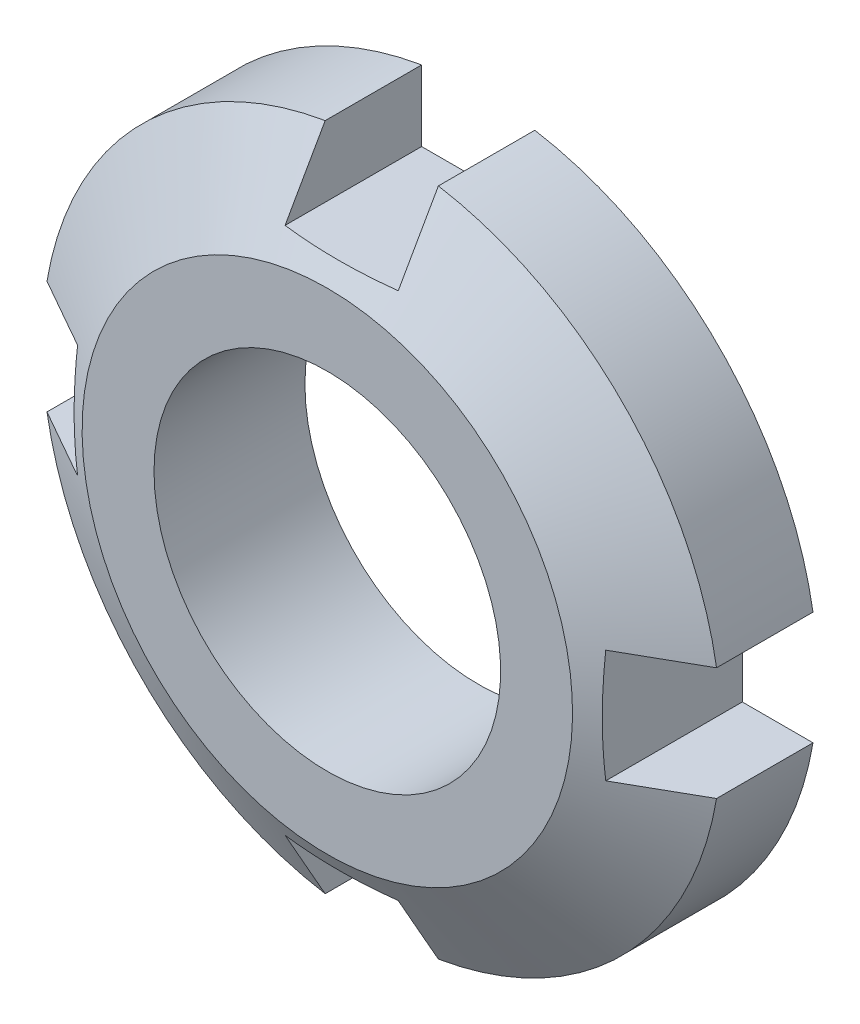
ISO-10303-21;
HEADER;
FILE_DESCRIPTION(('STEP AP214'),'2;1');
FILE_NAME('part.step','',(''),(''),'','','');
FILE_SCHEMA(('AUTOMOTIVE_DESIGN { 1 0 10303 214 1 1 1 1 }'));
ENDSEC;
DATA;
#1=APPLICATION_CONTEXT('core data for automotive mechanical design processes');
#2=APPLICATION_PROTOCOL_DEFINITION('international standard','automotive_design',2000,#1);
#3=PRODUCT_CONTEXT('',#1,'mechanical');
#4=PRODUCT('Part','Part','',(#3));
#5=PRODUCT_RELATED_PRODUCT_CATEGORY('part','',(#4));
#6=PRODUCT_DEFINITION_FORMATION('','',#4);
#7=PRODUCT_DEFINITION_CONTEXT('part definition',#1,'design');
#8=PRODUCT_DEFINITION('design','',#6,#7);
#9=PRODUCT_DEFINITION_SHAPE('','',#8);
#10=(LENGTH_UNIT() NAMED_UNIT(*) SI_UNIT(.MILLI.,.METRE.));
#11=(NAMED_UNIT(*) PLANE_ANGLE_UNIT() SI_UNIT($,.RADIAN.));
#12=(NAMED_UNIT(*) SI_UNIT($,.STERADIAN.) SOLID_ANGLE_UNIT());
#13=UNCERTAINTY_MEASURE_WITH_UNIT(LENGTH_MEASURE(1.E-05),#10,'distance_accuracy_value','');
#14=(GEOMETRIC_REPRESENTATION_CONTEXT(3) GLOBAL_UNCERTAINTY_ASSIGNED_CONTEXT((#13)) GLOBAL_UNIT_ASSIGNED_CONTEXT((#10,
#11,#12)) REPRESENTATION_CONTEXT('',''));
#15=CARTESIAN_POINT('',(0.,0.,0.));
#16=DIRECTION('',(0.,0.,1.));
#17=DIRECTION('',(1.,0.,0.));
#18=AXIS2_PLACEMENT_3D('',#15,#16,#17);
#19=CARTESIAN_POINT('',(0.,0.,0.));
#20=DIRECTION('',(0.,0.,-1.));
#21=DIRECTION('',(0.,1.,0.));
#22=AXIS2_PLACEMENT_3D('',#19,#20,#21);
#23=PLANE('',#22);
#24=CARTESIAN_POINT('',(0.,0.,0.));
#25=DIRECTION('',(0.,0.,-1.));
#26=DIRECTION('',(-1.,0.,0.));
#27=AXIS2_PLACEMENT_3D('',#24,#25,#26);
#28=CIRCLE('',#27,4.59399999999999);
#29=CARTESIAN_POINT('',(-4.59399999999999,0.,0.));
#30=VERTEX_POINT('',#29);
#31=EDGE_CURVE('E238',#30,#30,#28,.T.);
#32=ORIENTED_EDGE('',*,*,#31,.F.);
#33=EDGE_LOOP('',(#32));
#34=FACE_BOUND('',#33,.T.);
#35=CARTESIAN_POINT('',(0.,0.,0.));
#36=DIRECTION('',(0.,0.,-1.));
#37=DIRECTION('',(0.,1.,0.));
#38=AXIS2_PLACEMENT_3D('',#35,#36,#37);
#39=CIRCLE('',#38,9.);
#40=CARTESIAN_POINT('',(8.87411967464942,-1.5,0.));
#41=VERTEX_POINT('',#40);
#42=CARTESIAN_POINT('',(1.5,-8.87411967464942,0.));
#43=VERTEX_POINT('',#42);
#44=EDGE_CURVE('E174',#41,#43,#39,.T.);
#45=ORIENTED_EDGE('',*,*,#44,.T.);
#46=DIRECTION('',(0.,1.,0.));
#47=VECTOR('',#46,1.);
#48=CARTESIAN_POINT('',(1.5,-9.,0.));
#49=LINE('',#48,#47);
#50=CARTESIAN_POINT('',(1.5,-7.,0.));
#51=VERTEX_POINT('',#50);
#52=EDGE_CURVE('E158',#43,#51,#49,.T.);
#53=ORIENTED_EDGE('',*,*,#52,.T.);
#54=DIRECTION('',(-1.,0.,0.));
#55=VECTOR('',#54,1.);
#56=CARTESIAN_POINT('',(1.5,-7.,0.));
#57=LINE('',#56,#55);
#58=CARTESIAN_POINT('',(-1.5,-7.,0.));
#59=VERTEX_POINT('',#58);
#60=EDGE_CURVE('E165',#51,#59,#57,.T.);
#61=ORIENTED_EDGE('',*,*,#60,.T.);
#62=DIRECTION('',(0.,-1.,0.));
#63=VECTOR('',#62,1.);
#64=CARTESIAN_POINT('',(-1.5,-9.,0.));
#65=LINE('',#64,#63);
#66=CARTESIAN_POINT('',(-1.5,-8.87411967464942,0.));
#67=VERTEX_POINT('',#66);
#68=EDGE_CURVE('E169',#59,#67,#65,.T.);
#69=ORIENTED_EDGE('',*,*,#68,.T.);
#70=CARTESIAN_POINT('',(-8.87411967464942,-1.5,0.));
#71=VERTEX_POINT('',#70);
#72=EDGE_CURVE('E258',#67,#71,#39,.T.);
#73=ORIENTED_EDGE('',*,*,#72,.T.);
#74=DIRECTION('',(1.,0.,0.));
#75=VECTOR('',#74,1.);
#76=CARTESIAN_POINT('',(-9.,-1.5,0.));
#77=LINE('',#76,#75);
#78=CARTESIAN_POINT('',(-7.,-1.5,0.));
#79=VERTEX_POINT('',#78);
#80=EDGE_CURVE('E200',#71,#79,#77,.T.);
#81=ORIENTED_EDGE('',*,*,#80,.T.);
#82=DIRECTION('',(0.,1.,0.));
#83=VECTOR('',#82,1.);
#84=CARTESIAN_POINT('',(-7.,1.5,0.));
#85=LINE('',#84,#83);
#86=CARTESIAN_POINT('',(-7.,1.5,0.));
#87=VERTEX_POINT('',#86);
#88=EDGE_CURVE('E203',#79,#87,#85,.T.);
#89=ORIENTED_EDGE('',*,*,#88,.T.);
#90=DIRECTION('',(-1.,0.,0.));
#91=VECTOR('',#90,1.);
#92=CARTESIAN_POINT('',(-9.,1.5,0.));
#93=LINE('',#92,#91);
#94=CARTESIAN_POINT('',(-8.87411967464942,1.5,0.));
#95=VERTEX_POINT('',#94);
#96=EDGE_CURVE('E206',#87,#95,#93,.T.);
#97=ORIENTED_EDGE('',*,*,#96,.T.);
#98=CARTESIAN_POINT('',(-1.5,8.87411967464942,0.));
#99=VERTEX_POINT('',#98);
#100=EDGE_CURVE('E251',#95,#99,#39,.T.);
#101=ORIENTED_EDGE('',*,*,#100,.T.);
#102=DIRECTION('',(0.,-1.,0.));
#103=VECTOR('',#102,1.);
#104=CARTESIAN_POINT('',(-1.5,9.,0.));
#105=LINE('',#104,#103);
#106=CARTESIAN_POINT('',(-1.5,7.,0.));
#107=VERTEX_POINT('',#106);
#108=EDGE_CURVE('E219',#99,#107,#105,.T.);
#109=ORIENTED_EDGE('',*,*,#108,.T.);
#110=DIRECTION('',(1.,0.,0.));
#111=VECTOR('',#110,1.);
#112=CARTESIAN_POINT('',(-1.5,7.,0.));
#113=LINE('',#112,#111);
#114=CARTESIAN_POINT('',(1.5,7.,0.));
#115=VERTEX_POINT('',#114);
#116=EDGE_CURVE('E222',#107,#115,#113,.T.);
#117=ORIENTED_EDGE('',*,*,#116,.T.);
#118=DIRECTION('',(0.,1.,0.));
#119=VECTOR('',#118,1.);
#120=CARTESIAN_POINT('',(1.5,9.,0.));
#121=LINE('',#120,#119);
#122=CARTESIAN_POINT('',(1.5,8.87411967464942,0.));
#123=VERTEX_POINT('',#122);
#124=EDGE_CURVE('E225',#115,#123,#121,.T.);
#125=ORIENTED_EDGE('',*,*,#124,.T.);
#126=CARTESIAN_POINT('',(8.87411967464942,1.5,0.));
#127=VERTEX_POINT('',#126);
#128=EDGE_CURVE('E254',#123,#127,#39,.T.);
#129=ORIENTED_EDGE('',*,*,#128,.T.);
#130=DIRECTION('',(-1.,0.,0.));
#131=VECTOR('',#130,1.);
#132=CARTESIAN_POINT('',(9.,1.5,0.));
#133=LINE('',#132,#131);
#134=CARTESIAN_POINT('',(7.,1.5,0.));
#135=VERTEX_POINT('',#134);
#136=EDGE_CURVE('E183',#127,#135,#133,.T.);
#137=ORIENTED_EDGE('',*,*,#136,.T.);
#138=DIRECTION('',(0.,-1.,0.));
#139=VECTOR('',#138,1.);
#140=CARTESIAN_POINT('',(7.,1.5,0.));
#141=LINE('',#140,#139);
#142=CARTESIAN_POINT('',(7.,-1.5,0.));
#143=VERTEX_POINT('',#142);
#144=EDGE_CURVE('E186',#135,#143,#141,.T.);
#145=ORIENTED_EDGE('',*,*,#144,.T.);
#146=DIRECTION('',(1.,0.,0.));
#147=VECTOR('',#146,1.);
#148=CARTESIAN_POINT('',(9.,-1.5,0.));
#149=LINE('',#148,#147);
#150=EDGE_CURVE('E189',#143,#41,#149,.T.);
#151=ORIENTED_EDGE('',*,*,#150,.T.);
#152=EDGE_LOOP('',(#45,#53,#61,#69,#73,#81,#89,#97,#101,#109,#117,#125,#129,#137,#145,#151));
#153=FACE_BOUND('',#152,.T.);
#154=ADVANCED_FACE('F38',(#34,#153),#23,.T.);
#155=CARTESIAN_POINT('',(0.,0.,0.));
#156=DIRECTION('',(0.,0.,-1.));
#157=DIRECTION('',(0.,1.,0.));
#158=AXIS2_PLACEMENT_3D('',#155,#156,#157);
#159=CYLINDRICAL_SURFACE('',#158,9.);
#160=CARTESIAN_POINT('',(0.,0.,2.55662432702593));
#161=DIRECTION('',(0.,0.,-1.));
#162=DIRECTION('',(0.,1.,0.));
#163=AXIS2_PLACEMENT_3D('',#160,#161,#162);
#164=CIRCLE('',#163,9.);
#165=CARTESIAN_POINT('',(8.87411967464942,-1.5,2.55662432702593));
#166=VERTEX_POINT('',#165);
#167=CARTESIAN_POINT('',(1.5,-8.87411967464942,2.55662432702593));
#168=VERTEX_POINT('',#167);
#169=EDGE_CURVE('E252',#166,#168,#164,.T.);
#170=ORIENTED_EDGE('',*,*,#169,.T.);
#171=DIRECTION('',(0.,0.,-1.));
#172=VECTOR('',#171,1.);
#173=CARTESIAN_POINT('',(1.5,-8.87411967464942,0.));
#174=LINE('',#173,#172);
#175=EDGE_CURVE('E181',#168,#43,#174,.T.);
#176=ORIENTED_EDGE('',*,*,#175,.T.);
#177=ORIENTED_EDGE('',*,*,#44,.F.);
#178=DIRECTION('',(0.,0.,-1.));
#179=VECTOR('',#178,1.);
#180=CARTESIAN_POINT('',(8.87411967464942,-1.5,0.));
#181=LINE('',#180,#179);
#182=EDGE_CURVE('E194',#41,#166,#181,.F.);
#183=ORIENTED_EDGE('',*,*,#182,.T.);
#184=EDGE_LOOP('',(#170,#176,#177,#183));
#185=FACE_BOUND('',#184,.T.);
#186=ADVANCED_FACE('F328',(#185),#159,.T.);
#187=ORIENTED_EDGE('',*,*,#72,.F.);
#188=DIRECTION('',(0.,0.,-1.));
#189=VECTOR('',#188,1.);
#190=CARTESIAN_POINT('',(-1.5,-8.87411967464942,0.));
#191=LINE('',#190,#189);
#192=CARTESIAN_POINT('',(-1.5,-8.87411967464942,2.55662432702593));
#193=VERTEX_POINT('',#192);
#194=EDGE_CURVE('E162',#67,#193,#191,.F.);
#195=ORIENTED_EDGE('',*,*,#194,.T.);
#196=CARTESIAN_POINT('',(-8.87411967464942,-1.5,2.55662432702593));
#197=VERTEX_POINT('',#196);
#198=EDGE_CURVE('E253',#193,#197,#164,.T.);
#199=ORIENTED_EDGE('',*,*,#198,.T.);
#200=DIRECTION('',(0.,0.,-1.));
#201=VECTOR('',#200,1.);
#202=CARTESIAN_POINT('',(-8.87411967464942,-1.5,0.));
#203=LINE('',#202,#201);
#204=EDGE_CURVE('E216',#197,#71,#203,.T.);
#205=ORIENTED_EDGE('',*,*,#204,.T.);
#206=EDGE_LOOP('',(#187,#195,#199,#205));
#207=FACE_BOUND('',#206,.T.);
#208=ADVANCED_FACE('F333',(#207),#159,.T.);
#209=CARTESIAN_POINT('',(0.,0.,2.55662432702593));
#210=DIRECTION('',(0.,0.,-1.));
#211=DIRECTION('',(0.,1.,0.));
#212=AXIS2_PLACEMENT_3D('',#209,#210,#211);
#213=CONICAL_SURFACE('',#212,9.,1.0471975511966);
#214=CARTESIAN_POINT('',(0.,0.,4.));
#215=DIRECTION('',(0.,0.,-1.));
#216=DIRECTION('',(0.,1.,0.));
#217=AXIS2_PLACEMENT_3D('',#214,#215,#216);
#218=CIRCLE('',#217,6.5);
#219=CARTESIAN_POINT('',(0.,6.5,4.));
#220=VERTEX_POINT('',#219);
#221=EDGE_CURVE('E244',#220,#220,#218,.T.);
#222=ORIENTED_EDGE('',*,*,#221,.T.);
#223=EDGE_LOOP('',(#222));
#224=FACE_BOUND('',#223,.T.);
#225=CARTESIAN_POINT('',(-6.60803773799291,-7.,2.19501452779652));
#226=CARTESIAN_POINT('',(-6.38482094485606,-7.,2.28345242499498));
#227=CARTESIAN_POINT('',(-6.1607954440703,-7.,2.3698958757828));
#228=CARTESIAN_POINT('',(-5.71084766121369,-7.,2.5379234343994));
#229=CARTESIAN_POINT('',(-5.48492477034531,-7.,2.61950590882143));
#230=CARTESIAN_POINT('',(-5.02982445330478,-7.,2.77730630750442));
#231=CARTESIAN_POINT('',(-4.80063603398555,-7.,2.85349283377197));
#232=CARTESIAN_POINT('',(-4.34008923571827,-7.,2.99885984146847));
#233=CARTESIAN_POINT('',(-4.10873105569413,-7.,3.06804095842452));
#234=CARTESIAN_POINT('',(-3.425776991095,-7.,3.25904950570636));
#235=CARTESIAN_POINT('',(-2.97082288619208,-7.,3.36951126251846));
#236=CARTESIAN_POINT('',(-2.28278535795962,-7.,3.50367178193693));
#237=CARTESIAN_POINT('',(-2.05273634867589,-7.,3.54311302932607));
#238=CARTESIAN_POINT('',(-1.59094384724694,-7.,3.6102669930596));
#239=CARTESIAN_POINT('',(-1.35920059356612,-7.,3.63798132882123));
#240=CARTESIAN_POINT('',(-0.809979974229756,-7.,3.68836049911879));
#241=CARTESIAN_POINT('',(-0.49197616406506,-7.,3.70552266227315));
#242=CARTESIAN_POINT('',(0.144641941210663,-7.,3.71463987385341));
#243=CARTESIAN_POINT('',(0.46325650751978,-7.,3.70657731748422));
#244=CARTESIAN_POINT('',(0.943233982618241,-7.,3.67586867068627));
#245=CARTESIAN_POINT('',(1.10523383170887,-7.,3.66229228187502));
#246=CARTESIAN_POINT('',(1.42862375519057,-7.,3.62903708551741));
#247=CARTESIAN_POINT('',(1.5900137867909,-7.,3.60935785749967));
#248=CARTESIAN_POINT('',(1.91186468051426,-7.,3.56426603760904));
#249=CARTESIAN_POINT('',(2.07232612348097,-7.,3.53885754685647));
#250=CARTESIAN_POINT('',(2.39228625310242,-7.,3.48273532700505));
#251=CARTESIAN_POINT('',(2.55178513392221,-7.,3.45202270756223));
#252=CARTESIAN_POINT('',(2.71076148925265,-7.,3.41887058817287));
#253=B_SPLINE_CURVE_WITH_KNOTS('',3,(#225,#226,#227,#228,#229,#230,#231,#232,#233,#234,#235,
#236,#237,#238,#239,#240,#241,#242,#243,#244,#245,#246,#247,#248,#249,#250,#251,#252),
.UNSPECIFIED.,.F.,.F.,(4,2,2,2,2,2,2,2,2,2,2,2,2,4),(0.,0.720307917474698,1.44085652662286,
2.16530192115533,2.88968153538715,4.29239440099747,4.99236196751632,5.69223284107739,
6.64665173394746,7.6017368818483,8.08934224559687,8.57698121168375,9.06427221800965,
9.55146140330965),.UNSPECIFIED.);
#254=CARTESIAN_POINT('',(-1.5,-7.,3.61957782718682));
#255=VERTEX_POINT('',#254);
#256=CARTESIAN_POINT('',(1.5,-7.,3.61957782718682));
#257=VERTEX_POINT('',#256);
#258=EDGE_CURVE('E50',#255,#257,#253,.T.);
#259=ORIENTED_EDGE('',*,*,#258,.T.);
#260=CARTESIAN_POINT('',(1.5,-4.51467978783632,5.00612220364092));
#261=CARTESIAN_POINT('',(1.5,-4.68693959407264,4.9117250538693));
#262=CARTESIAN_POINT('',(1.5,-4.85898620881287,4.81694043778456));
#263=CARTESIAN_POINT('',(1.5,-5.20273855542667,4.62675676645979));
#264=CARTESIAN_POINT('',(1.5,-5.37444428891128,4.53135771413276));
#265=CARTESIAN_POINT('',(1.5,-5.71759997995971,4.34010589422538));
#266=CARTESIAN_POINT('',(1.5,-5.88904994051637,4.24425313200963));
#267=CARTESIAN_POINT('',(1.5,-6.23175002566476,4.05219057913551));
#268=CARTESIAN_POINT('',(1.5,-6.40300014998253,3.95598078798846));
#269=CARTESIAN_POINT('',(1.5,-6.91650897072724,3.66693700990015));
#270=CARTESIAN_POINT('',(1.5,-7.25853238799103,3.47368511418433));
#271=CARTESIAN_POINT('',(1.5,-7.94216849744405,3.08645415212913));
#272=CARTESIAN_POINT('',(1.5,-8.28378118818812,2.892475083241));
#273=CARTESIAN_POINT('',(1.5,-8.96671195027129,2.50401460332847));
#274=CARTESIAN_POINT('',(1.5,-9.30803002722762,2.30953320217727));
#275=CARTESIAN_POINT('',(1.5,-9.99045971886807,1.92020980934183));
#276=CARTESIAN_POINT('',(1.5,-10.3315713338536,1.72536781818574));
#277=CARTESIAN_POINT('',(1.5,-11.3546764457974,1.14041538901457));
#278=CARTESIAN_POINT('',(1.5,-12.0364296537756,0.74988450758946));
#279=CARTESIAN_POINT('',(1.5,-12.7180455932196,0.359115416959897));
#280=B_SPLINE_CURVE_WITH_KNOTS('',3,(#260,#261,#262,#263,#264,#265,#266,#267,#268,#269,#270,
#271,#272,#273,#274,#275,#276,#277,#278,#279),.UNSPECIFIED.,.F.,.F.,(4,2,2,2,2,2,2,2,2,4),(0.,
0.589284735529803,1.17856667936321,1.76784167292643,2.35711747335124,3.53564751811737,
4.71418169752645,5.89269288684273,7.07120235137822,9.42825772467926),.UNSPECIFIED.);
#281=EDGE_CURVE('E11',#257,#168,#280,.T.);
#282=ORIENTED_EDGE('',*,*,#281,.T.);
#283=ORIENTED_EDGE('',*,*,#169,.F.);
#284=CARTESIAN_POINT('',(11.9636345363038,-1.5,0.791489720304736));
#285=CARTESIAN_POINT('',(11.622757423634,-1.5,0.986760179869544));
#286=CARTESIAN_POINT('',(11.2818295472936,-1.5,1.1819421654886));
#287=CARTESIAN_POINT('',(10.5998274317525,-1.5,1.57205048639679));
#288=CARTESIAN_POINT('',(10.2587531925056,-1.5,1.76697682160527));
#289=CARTESIAN_POINT('',(9.57642396809998,-1.5,2.15648917183095));
#290=CARTESIAN_POINT('',(9.235168988672,-1.5,2.35107519688464));
#291=CARTESIAN_POINT('',(8.55239494097444,-1.5,2.73978626759009));
#292=CARTESIAN_POINT('',(8.21087587181288,-1.5,2.93391131167576));
#293=CARTESIAN_POINT('',(7.52744950400627,-1.5,3.32150911424444));
#294=CARTESIAN_POINT('',(7.18554219028835,-1.5,3.51498184615861));
#295=CARTESIAN_POINT('',(6.50117556688201,-1.5,3.9009436650992));
#296=CARTESIAN_POINT('',(6.15871626162175,-1.5,4.09343275996534));
#297=CARTESIAN_POINT('',(5.64435744918873,-1.5,4.38098377398079));
#298=CARTESIAN_POINT('',(5.47278964539379,-1.5,4.47663879011197));
#299=CARTESIAN_POINT('',(5.12936370669175,-1.5,4.66742495456));
#300=CARTESIAN_POINT('',(4.95750557282013,-1.5,4.76255610474013));
#301=CARTESIAN_POINT('',(4.61340494716609,-1.5,4.95213309171488));
#302=CARTESIAN_POINT('',(4.44116244505361,-1.5,5.04657890979368));
#303=CARTESIAN_POINT('',(4.09614322334866,-1.5,5.23449413455944));
#304=CARTESIAN_POINT('',(3.92336649717775,-1.5,5.32796352916015));
#305=CARTESIAN_POINT('',(3.75024752574206,-1.5,5.42079929813102));
#306=B_SPLINE_CURVE_WITH_KNOTS('',3,(#284,#285,#286,#287,#288,#289,#290,#291,#292,#293,#294,
#295,#296,#297,#298,#299,#300,#301,#302,#303,#304,#305),.UNSPECIFIED.,.F.,.F.,(4,2,2,2,2,2,2,2,
2,2,4),(0.,1.17853724953704,2.35707487079881,3.53557712764535,4.71408338253777,5.89263707205156,
7.07118135362958,7.6604755982819,8.24976774560238,8.83907592587174,9.4283913920213),.UNSPECIFIED.);
#307=CARTESIAN_POINT('',(7.,-1.5,3.61957782718682));
#308=VERTEX_POINT('',#307);
#309=EDGE_CURVE('E381',#166,#308,#306,.T.);
#310=ORIENTED_EDGE('',*,*,#309,.T.);
#311=CARTESIAN_POINT('',(7.,-6.60803773799292,2.19501452779652));
#312=CARTESIAN_POINT('',(7.,-6.38482094485606,2.28345242499498));
#313=CARTESIAN_POINT('',(7.,-6.1607954440703,2.3698958757828));
#314=CARTESIAN_POINT('',(7.,-5.71084766121369,2.5379234343994));
#315=CARTESIAN_POINT('',(7.,-5.48492477034531,2.61950590882143));
#316=CARTESIAN_POINT('',(7.,-5.02982445330478,2.77730630750442));
#317=CARTESIAN_POINT('',(7.,-4.80063603398555,2.85349283377197));
#318=CARTESIAN_POINT('',(7.,-4.34008923571827,2.99885984146847));
#319=CARTESIAN_POINT('',(7.,-4.10873105569413,3.06804095842452));
#320=CARTESIAN_POINT('',(7.,-3.425776991095,3.25904950570636));
#321=CARTESIAN_POINT('',(7.,-2.97082288619208,3.36951126251846));
#322=CARTESIAN_POINT('',(7.,-2.28278535795962,3.50367178193693));
#323=CARTESIAN_POINT('',(7.,-2.05273634867589,3.54311302932607));
#324=CARTESIAN_POINT('',(7.,-1.59094384724694,3.61026699305961));
#325=CARTESIAN_POINT('',(7.,-1.35920059356612,3.63798132882124));
#326=CARTESIAN_POINT('',(7.,-0.80997997422976,3.68836049911879));
#327=CARTESIAN_POINT('',(7.,-0.491976164065064,3.70552266227315));
#328=CARTESIAN_POINT('',(7.,0.144641941210659,3.71463987385341));
#329=CARTESIAN_POINT('',(7.,0.463256507519776,3.70657731748422));
#330=CARTESIAN_POINT('',(7.,0.943233982618237,3.67586867068627));
#331=CARTESIAN_POINT('',(7.,1.10523383170887,3.66229228187502));
#332=CARTESIAN_POINT('',(7.,1.42862375519056,3.62903708551742));
#333=CARTESIAN_POINT('',(7.,1.5900137867909,3.60935785749968));
#334=CARTESIAN_POINT('',(7.,1.91186468051426,3.56426603760904));
#335=CARTESIAN_POINT('',(7.,2.07232612348097,3.53885754685647));
#336=CARTESIAN_POINT('',(7.,2.39228625310242,3.48273532700506));
#337=CARTESIAN_POINT('',(7.,2.55178513392221,3.45202270756223));
#338=CARTESIAN_POINT('',(7.,2.71076148925265,3.41887058817287));
#339=B_SPLINE_CURVE_WITH_KNOTS('',3,(#311,#312,#313,#314,#315,#316,#317,#318,#319,#320,#321,
#322,#323,#324,#325,#326,#327,#328,#329,#330,#331,#332,#333,#334,#335,#336,#337,#338),
.UNSPECIFIED.,.F.,.F.,(4,2,2,2,2,2,2,2,2,2,2,2,2,4),(0.,0.720307917474699,1.44085652662286,
2.16530192115533,2.88968153538715,4.29239440099747,4.99236196751632,5.69223284107739,
6.64665173394746,7.60173688184829,8.08934224559686,8.57698121168375,9.06427221800965,
9.55146140330965),.UNSPECIFIED.);
#340=CARTESIAN_POINT('',(7.,1.5,3.61957782718682));
#341=VERTEX_POINT('',#340);
#342=EDGE_CURVE('E387',#308,#341,#339,.T.);
#343=ORIENTED_EDGE('',*,*,#342,.T.);
#344=CARTESIAN_POINT('',(3.75024752574206,1.5,5.42079929813102));
#345=CARTESIAN_POINT('',(3.92336649717775,1.5,5.32796352916015));
#346=CARTESIAN_POINT('',(4.09614322334866,1.5,5.23449413455944));
#347=CARTESIAN_POINT('',(4.44116244505361,1.5,5.04657890979368));
#348=CARTESIAN_POINT('',(4.61340494716609,1.5,4.95213309171488));
#349=CARTESIAN_POINT('',(4.95750557282013,1.5,4.76255610474013));
#350=CARTESIAN_POINT('',(5.12936370669175,1.5,4.66742495456));
#351=CARTESIAN_POINT('',(5.47278964539379,1.5,4.47663879011197));
#352=CARTESIAN_POINT('',(5.64435744918872,1.5,4.38098377398079));
#353=CARTESIAN_POINT('',(6.15871626162174,1.5,4.09343275996534));
#354=CARTESIAN_POINT('',(6.50117556688201,1.5,3.9009436650992));
#355=CARTESIAN_POINT('',(7.18554219028835,1.5,3.51498184615861));
#356=CARTESIAN_POINT('',(7.52744950400627,1.5,3.32150911424444));
#357=CARTESIAN_POINT('',(8.21087587181288,1.5,2.93391131167576));
#358=CARTESIAN_POINT('',(8.55239494097444,1.5,2.73978626759009));
#359=CARTESIAN_POINT('',(9.23516898867199,1.5,2.35107519688464));
#360=CARTESIAN_POINT('',(9.57642396809998,1.5,2.15648917183096));
#361=CARTESIAN_POINT('',(10.2587531925056,1.5,1.76697682160527));
#362=CARTESIAN_POINT('',(10.5998274317525,1.5,1.57205048639679));
#363=CARTESIAN_POINT('',(11.2818295472936,1.5,1.1819421654886));
#364=CARTESIAN_POINT('',(11.622757423634,1.5,0.986760179869544));
#365=CARTESIAN_POINT('',(11.9636345363038,1.5,0.791489720304737));
#366=B_SPLINE_CURVE_WITH_KNOTS('',3,(#344,#345,#346,#347,#348,#349,#350,#351,#352,#353,#354,
#355,#356,#357,#358,#359,#360,#361,#362,#363,#364,#365),.UNSPECIFIED.,.F.,.F.,(4,2,2,2,2,2,2,2,
2,2,4),(0.,0.589315466149557,1.17862364641892,1.7679157937394,2.35721003839172,3.53575431996974,
4.71430800948353,5.89281426437595,7.07131652122248,8.24985414248425,9.4283913920213),.UNSPECIFIED.);
#367=CARTESIAN_POINT('',(8.87411967464942,1.5,2.55662432702593));
#368=VERTEX_POINT('',#367);
#369=EDGE_CURVE('E357',#341,#368,#366,.T.);
#370=ORIENTED_EDGE('',*,*,#369,.T.);
#371=CARTESIAN_POINT('',(1.5,8.87411967464942,2.55662432702593));
#372=VERTEX_POINT('',#371);
#373=EDGE_CURVE('E248',#372,#368,#164,.T.);
#374=ORIENTED_EDGE('',*,*,#373,.F.);
#375=CARTESIAN_POINT('',(1.5,11.9636345363038,0.791489720304739));
#376=CARTESIAN_POINT('',(1.5,11.622757423634,0.986760179869546));
#377=CARTESIAN_POINT('',(1.5,11.2818295472936,1.1819421654886));
#378=CARTESIAN_POINT('',(1.5,10.5998274317525,1.57205048639679));
#379=CARTESIAN_POINT('',(1.5,10.2587531925056,1.76697682160527));
#380=CARTESIAN_POINT('',(1.5,9.57642396809998,2.15648917183096));
#381=CARTESIAN_POINT('',(1.5,9.23516898867199,2.35107519688464));
#382=CARTESIAN_POINT('',(1.5,8.55239494097444,2.73978626759009));
#383=CARTESIAN_POINT('',(1.5,8.21087587181288,2.93391131167576));
#384=CARTESIAN_POINT('',(1.5,7.52744950400628,3.32150911424444));
#385=CARTESIAN_POINT('',(1.5,7.18554219028835,3.51498184615861));
#386=CARTESIAN_POINT('',(1.5,6.50117556688201,3.9009436650992));
#387=CARTESIAN_POINT('',(1.5,6.15871626162175,4.09343275996534));
#388=CARTESIAN_POINT('',(1.5,5.64435744918873,4.38098377398079));
#389=CARTESIAN_POINT('',(1.5,5.47278964539379,4.47663879011197));
#390=CARTESIAN_POINT('',(1.5,5.12936370669176,4.66742495456));
#391=CARTESIAN_POINT('',(1.5,4.95750557282013,4.76255610474013));
#392=CARTESIAN_POINT('',(1.5,4.6134049471661,4.95213309171488));
#393=CARTESIAN_POINT('',(1.5,4.44116244505362,5.04657890979368));
#394=CARTESIAN_POINT('',(1.5,4.09614322334867,5.23449413455944));
#395=CARTESIAN_POINT('',(1.5,3.92336649717775,5.32796352916015));
#396=CARTESIAN_POINT('',(1.5,3.75024752574207,5.42079929813101));
#397=B_SPLINE_CURVE_WITH_KNOTS('',3,(#375,#376,#377,#378,#379,#380,#381,#382,#383,#384,#385,
#386,#387,#388,#389,#390,#391,#392,#393,#394,#395,#396),.UNSPECIFIED.,.F.,.F.,(4,2,2,2,2,2,2,2,
2,2,4),(0.,1.17853724953704,2.35707487079881,3.53557712764535,4.71408338253777,5.89263707205155,
7.07118135362957,7.6604755982819,8.24976774560237,8.83907592587173,9.42839139202129),.UNSPECIFIED.);
#398=CARTESIAN_POINT('',(1.5,7.,3.61957782718682));
#399=VERTEX_POINT('',#398);
#400=EDGE_CURVE('E257',#372,#399,#397,.T.);
#401=ORIENTED_EDGE('',*,*,#400,.T.);
#402=CARTESIAN_POINT('',(2.71076148925265,7.,3.41887058817287));
#403=CARTESIAN_POINT('',(2.55178513392221,7.,3.45202270756223));
#404=CARTESIAN_POINT('',(2.39228625310242,7.,3.48273532700506));
#405=CARTESIAN_POINT('',(2.07232612348097,7.,3.53885754685647));
#406=CARTESIAN_POINT('',(1.91186468051426,7.,3.56426603760904));
#407=CARTESIAN_POINT('',(1.5900137867909,7.,3.60935785749968));
#408=CARTESIAN_POINT('',(1.42862375519056,7.,3.62903708551741));
#409=CARTESIAN_POINT('',(1.10523383170887,7.,3.66229228187502));
#410=CARTESIAN_POINT('',(0.943233982618238,7.,3.67586867068627));
#411=CARTESIAN_POINT('',(0.463256507519777,7.,3.70657731748422));
#412=CARTESIAN_POINT('',(0.14464194121066,7.,3.71463987385341));
#413=CARTESIAN_POINT('',(-0.491976164065064,7.,3.70552266227315));
#414=CARTESIAN_POINT('',(-0.80997997422976,7.,3.68836049911879));
#415=CARTESIAN_POINT('',(-1.35920059356612,7.,3.63798132882124));
#416=CARTESIAN_POINT('',(-1.59094384724694,7.,3.61026699305961));
#417=CARTESIAN_POINT('',(-2.05273634867589,7.,3.54311302932607));
#418=CARTESIAN_POINT('',(-2.28278535795962,7.,3.50367178193693));
#419=CARTESIAN_POINT('',(-2.97082288619208,7.,3.36951126251846));
#420=CARTESIAN_POINT('',(-3.425776991095,7.,3.25904950570636));
#421=CARTESIAN_POINT('',(-4.10873105569413,7.,3.06804095842452));
#422=CARTESIAN_POINT('',(-4.34008923571827,7.,2.99885984146847));
#423=CARTESIAN_POINT('',(-4.80063603398555,7.,2.85349283377197));
#424=CARTESIAN_POINT('',(-5.02982445330478,7.,2.77730630750442));
#425=CARTESIAN_POINT('',(-5.48492477034531,7.,2.61950590882143));
#426=CARTESIAN_POINT('',(-5.71084766121369,7.,2.5379234343994));
#427=CARTESIAN_POINT('',(-6.1607954440703,7.,2.3698958757828));
#428=CARTESIAN_POINT('',(-6.38482094485606,7.,2.28345242499498));
#429=CARTESIAN_POINT('',(-6.60803773799292,7.,2.19501452779652));
#430=B_SPLINE_CURVE_WITH_KNOTS('',3,(#402,#403,#404,#405,#406,#407,#408,#409,#410,#411,#412,
#413,#414,#415,#416,#417,#418,#419,#420,#421,#422,#423,#424,#425,#426,#427,#428,#429),
.UNSPECIFIED.,.F.,.F.,(4,2,2,2,2,2,2,2,2,2,2,2,2,4),(0.,0.487189185299999,0.974480191625907,
1.46211915771279,1.94972452146136,2.90480966936219,3.85922856223227,4.55909943579334,
5.25906700231219,6.6617798679225,7.38615948215432,8.1106048766868,8.83115348583495,
9.55146140330965),.UNSPECIFIED.);
#431=CARTESIAN_POINT('',(-1.5,7.,3.61957782718682));
#432=VERTEX_POINT('',#431);
#433=EDGE_CURVE('E265',#399,#432,#430,.T.);
#434=ORIENTED_EDGE('',*,*,#433,.T.);
#435=CARTESIAN_POINT('',(-1.5,3.75024752574207,5.42079929813101));
#436=CARTESIAN_POINT('',(-1.5,3.92336649717775,5.32796352916015));
#437=CARTESIAN_POINT('',(-1.5,4.09614322334867,5.23449413455943));
#438=CARTESIAN_POINT('',(-1.5,4.44116244505362,5.04657890979368));
#439=CARTESIAN_POINT('',(-1.5,4.6134049471661,4.95213309171488));
#440=CARTESIAN_POINT('',(-1.5,4.95750557282013,4.76255610474013));
#441=CARTESIAN_POINT('',(-1.5,5.12936370669176,4.66742495456));
#442=CARTESIAN_POINT('',(-1.5,5.47278964539379,4.47663879011197));
#443=CARTESIAN_POINT('',(-1.5,5.64435744918873,4.38098377398079));
#444=CARTESIAN_POINT('',(-1.5,6.15871626162175,4.09343275996534));
#445=CARTESIAN_POINT('',(-1.5,6.50117556688201,3.9009436650992));
#446=CARTESIAN_POINT('',(-1.5,7.18554219028835,3.51498184615861));
#447=CARTESIAN_POINT('',(-1.5,7.52744950400627,3.32150911424444));
#448=CARTESIAN_POINT('',(-1.5,8.21087587181288,2.93391131167576));
#449=CARTESIAN_POINT('',(-1.5,8.55239494097444,2.73978626759009));
#450=CARTESIAN_POINT('',(-1.5,9.23516898867199,2.35107519688464));
#451=CARTESIAN_POINT('',(-1.5,9.57642396809998,2.15648917183096));
#452=CARTESIAN_POINT('',(-1.5,10.2587531925056,1.76697682160528));
#453=CARTESIAN_POINT('',(-1.5,10.5998274317525,1.57205048639679));
#454=CARTESIAN_POINT('',(-1.5,11.2818295472936,1.1819421654886));
#455=CARTESIAN_POINT('',(-1.5,11.622757423634,0.98676017986955));
#456=CARTESIAN_POINT('',(-1.5,11.9636345363038,0.791489720304742));
#457=B_SPLINE_CURVE_WITH_KNOTS('',3,(#435,#436,#437,#438,#439,#440,#441,#442,#443,#444,#445,
#446,#447,#448,#449,#450,#451,#452,#453,#454,#455,#456),.UNSPECIFIED.,.F.,.F.,(4,2,2,2,2,2,2,2,
2,2,4),(0.,0.589315466149557,1.17862364641891,1.76791579373939,2.35721003839172,
3.53575431996973,4.71430800948352,5.89281426437594,7.07131652122248,8.24985414248424,
9.42839139202128),.UNSPECIFIED.);
#458=CARTESIAN_POINT('',(-1.5,8.87411967464942,2.55662432702593));
#459=VERTEX_POINT('',#458);
#460=EDGE_CURVE('E293',#432,#459,#457,.T.);
#461=ORIENTED_EDGE('',*,*,#460,.T.);
#462=CARTESIAN_POINT('',(-8.87411967464942,1.5,2.55662432702593));
#463=VERTEX_POINT('',#462);
#464=EDGE_CURVE('E247',#463,#459,#164,.T.);
#465=ORIENTED_EDGE('',*,*,#464,.F.);
#466=CARTESIAN_POINT('',(-12.7180455932196,1.5,0.359115416959897));
#467=CARTESIAN_POINT('',(-12.0364296537756,1.5,0.749884507589463));
#468=CARTESIAN_POINT('',(-11.3546764457974,1.5,1.14041538901457));
#469=CARTESIAN_POINT('',(-10.3315713338536,1.5,1.72536781818574));
#470=CARTESIAN_POINT('',(-9.99045971886807,1.5,1.92020980934183));
#471=CARTESIAN_POINT('',(-9.30803002722763,1.5,2.30953320217727));
#472=CARTESIAN_POINT('',(-8.96671195027129,1.5,2.50401460332847));
#473=CARTESIAN_POINT('',(-8.28378118818812,1.5,2.892475083241));
#474=CARTESIAN_POINT('',(-7.94216849744405,1.5,3.08645415212913));
#475=CARTESIAN_POINT('',(-7.25853238799103,1.5,3.47368511418433));
#476=CARTESIAN_POINT('',(-6.91650897072724,1.5,3.66693700990016));
#477=CARTESIAN_POINT('',(-6.40300014998252,1.5,3.95598078798846));
#478=CARTESIAN_POINT('',(-6.23175002566476,1.5,4.05219057913551));
#479=CARTESIAN_POINT('',(-5.88904994051637,1.5,4.24425313200963));
#480=CARTESIAN_POINT('',(-5.7175999799597,1.5,4.34010589422538));
#481=CARTESIAN_POINT('',(-5.37444428891128,1.5,4.53135771413276));
#482=CARTESIAN_POINT('',(-5.20273855542666,1.5,4.62675676645979));
#483=CARTESIAN_POINT('',(-4.85898620881287,1.5,4.81694043778456));
#484=CARTESIAN_POINT('',(-4.68693959407264,1.5,4.91172505386931));
#485=CARTESIAN_POINT('',(-4.51467978783631,1.5,5.00612220364092));
#486=B_SPLINE_CURVE_WITH_KNOTS('',3,(#466,#467,#468,#469,#470,#471,#472,#473,#474,#475,#476,
#477,#478,#479,#480,#481,#482,#483,#484,#485),.UNSPECIFIED.,.F.,.F.,(4,2,2,2,2,2,2,2,2,4),(0.,
2.35705537330104,3.53556483783653,4.71407602715281,5.89261020656189,7.07114025132802,
7.66041605175284,8.24969104531606,8.83897298914946,9.42825772467927),.UNSPECIFIED.);
#487=CARTESIAN_POINT('',(-7.,1.5,3.61957782718682));
#488=VERTEX_POINT('',#487);
#489=EDGE_CURVE('E299',#463,#488,#486,.T.);
#490=ORIENTED_EDGE('',*,*,#489,.T.);
#491=CARTESIAN_POINT('',(-7.,2.71076148925265,3.41887058817287));
#492=CARTESIAN_POINT('',(-7.,2.55178513392221,3.45202270756223));
#493=CARTESIAN_POINT('',(-7.,2.39228625310242,3.48273532700506));
#494=CARTESIAN_POINT('',(-7.,2.07232612348097,3.53885754685647));
#495=CARTESIAN_POINT('',(-7.,1.91186468051425,3.56426603760904));
#496=CARTESIAN_POINT('',(-7.,1.5900137867909,3.60935785749968));
#497=CARTESIAN_POINT('',(-7.,1.42862375519056,3.62903708551742));
#498=CARTESIAN_POINT('',(-7.,1.10523383170887,3.66229228187502));
#499=CARTESIAN_POINT('',(-7.,0.943233982618238,3.67586867068627));
#500=CARTESIAN_POINT('',(-7.,0.463256507519777,3.70657731748422));
#501=CARTESIAN_POINT('',(-7.,0.144641941210659,3.71463987385341));
#502=CARTESIAN_POINT('',(-7.,-0.491976164065064,3.70552266227315));
#503=CARTESIAN_POINT('',(-7.,-0.809979974229759,3.68836049911879));
#504=CARTESIAN_POINT('',(-7.,-1.35920059356612,3.63798132882124));
#505=CARTESIAN_POINT('',(-7.,-1.59094384724694,3.61026699305961));
#506=CARTESIAN_POINT('',(-7.,-2.05273634867589,3.54311302932607));
#507=CARTESIAN_POINT('',(-7.,-2.28278535795962,3.50367178193693));
#508=CARTESIAN_POINT('',(-7.,-2.97082288619208,3.36951126251846));
#509=CARTESIAN_POINT('',(-7.,-3.425776991095,3.25904950570636));
#510=CARTESIAN_POINT('',(-7.,-4.10873105569413,3.06804095842452));
#511=CARTESIAN_POINT('',(-7.,-4.34008923571827,2.99885984146847));
#512=CARTESIAN_POINT('',(-7.,-4.80063603398555,2.85349283377197));
#513=CARTESIAN_POINT('',(-7.,-5.02982445330478,2.77730630750442));
#514=CARTESIAN_POINT('',(-7.,-5.48492477034531,2.61950590882143));
#515=CARTESIAN_POINT('',(-7.,-5.71084766121369,2.5379234343994));
#516=CARTESIAN_POINT('',(-7.,-6.1607954440703,2.3698958757828));
#517=CARTESIAN_POINT('',(-7.,-6.38482094485606,2.28345242499498));
#518=CARTESIAN_POINT('',(-7.,-6.60803773799292,2.19501452779652));
#519=B_SPLINE_CURVE_WITH_KNOTS('',3,(#491,#492,#493,#494,#495,#496,#497,#498,#499,#500,#501,
#502,#503,#504,#505,#506,#507,#508,#509,#510,#511,#512,#513,#514,#515,#516,#517,#518),
.UNSPECIFIED.,.F.,.F.,(4,2,2,2,2,2,2,2,2,2,2,2,2,4),(0.,0.487189185299999,0.974480191625906,
1.46211915771279,1.94972452146136,2.90480966936219,3.85922856223226,4.55909943579334,
5.25906700231219,6.6617798679225,7.38615948215432,8.1106048766868,8.83115348583495,
9.55146140330965),.UNSPECIFIED.);
#520=CARTESIAN_POINT('',(-7.,-1.5,3.61957782718682));
#521=VERTEX_POINT('',#520);
#522=EDGE_CURVE('E306',#488,#521,#519,.T.);
#523=ORIENTED_EDGE('',*,*,#522,.T.);
#524=CARTESIAN_POINT('',(-4.51467978783631,-1.5,5.00612220364092));
#525=CARTESIAN_POINT('',(-4.68693959407264,-1.5,4.91172505386931));
#526=CARTESIAN_POINT('',(-4.85898620881287,-1.5,4.81694043778456));
#527=CARTESIAN_POINT('',(-5.20273855542666,-1.5,4.62675676645979));
#528=CARTESIAN_POINT('',(-5.37444428891128,-1.5,4.53135771413276));
#529=CARTESIAN_POINT('',(-5.7175999799597,-1.5,4.34010589422538));
#530=CARTESIAN_POINT('',(-5.88904994051637,-1.5,4.24425313200963));
#531=CARTESIAN_POINT('',(-6.23175002566476,-1.5,4.05219057913551));
#532=CARTESIAN_POINT('',(-6.40300014998252,-1.5,3.95598078798846));
#533=CARTESIAN_POINT('',(-6.91650897072724,-1.5,3.66693700990016));
#534=CARTESIAN_POINT('',(-7.25853238799103,-1.5,3.47368511418433));
#535=CARTESIAN_POINT('',(-7.94216849744404,-1.5,3.08645415212913));
#536=CARTESIAN_POINT('',(-8.28378118818812,-1.5,2.892475083241));
#537=CARTESIAN_POINT('',(-8.96671195027128,-1.5,2.50401460332847));
#538=CARTESIAN_POINT('',(-9.30803002722762,-1.5,2.30953320217727));
#539=CARTESIAN_POINT('',(-9.99045971886807,-1.5,1.92020980934183));
#540=CARTESIAN_POINT('',(-10.3315713338536,-1.5,1.72536781818574));
#541=CARTESIAN_POINT('',(-11.3546764457974,-1.5,1.14041538901457));
#542=CARTESIAN_POINT('',(-12.0364296537756,-1.5,0.74988450758946));
#543=CARTESIAN_POINT('',(-12.7180455932196,-1.5,0.359115416959897));
#544=B_SPLINE_CURVE_WITH_KNOTS('',3,(#524,#525,#526,#527,#528,#529,#530,#531,#532,#533,#534,
#535,#536,#537,#538,#539,#540,#541,#542,#543),.UNSPECIFIED.,.F.,.F.,(4,2,2,2,2,2,2,2,2,4),(0.,
0.589284735529804,1.17856667936321,1.76784167292643,2.35711747335124,3.53564751811738,
4.71418169752645,5.89269288684273,7.07120235137823,9.42825772467927),.UNSPECIFIED.);
#545=EDGE_CURVE('E388',#521,#197,#544,.T.);
#546=ORIENTED_EDGE('',*,*,#545,.T.);
#547=ORIENTED_EDGE('',*,*,#198,.F.);
#548=CARTESIAN_POINT('',(-1.5,-12.7180455932196,0.359115416959896));
#549=CARTESIAN_POINT('',(-1.5,-12.0364296537756,0.749884507589462));
#550=CARTESIAN_POINT('',(-1.5,-11.3546764457974,1.14041538901457));
#551=CARTESIAN_POINT('',(-1.5,-10.3315713338536,1.72536781818574));
#552=CARTESIAN_POINT('',(-1.5,-9.99045971886807,1.92020980934183));
#553=CARTESIAN_POINT('',(-1.5,-9.30803002722762,2.30953320217727));
#554=CARTESIAN_POINT('',(-1.5,-8.96671195027129,2.50401460332847));
#555=CARTESIAN_POINT('',(-1.5,-8.28378118818812,2.892475083241));
#556=CARTESIAN_POINT('',(-1.5,-7.94216849744405,3.08645415212913));
#557=CARTESIAN_POINT('',(-1.5,-7.25853238799103,3.47368511418433));
#558=CARTESIAN_POINT('',(-1.5,-6.91650897072725,3.66693700990015));
#559=CARTESIAN_POINT('',(-1.5,-6.40300014998253,3.95598078798846));
#560=CARTESIAN_POINT('',(-1.5,-6.23175002566476,4.05219057913551));
#561=CARTESIAN_POINT('',(-1.5,-5.88904994051638,4.24425313200963));
#562=CARTESIAN_POINT('',(-1.5,-5.71759997995971,4.34010589422538));
#563=CARTESIAN_POINT('',(-1.5,-5.37444428891128,4.53135771413276));
#564=CARTESIAN_POINT('',(-1.5,-5.20273855542667,4.62675676645979));
#565=CARTESIAN_POINT('',(-1.5,-4.85898620881287,4.81694043778456));
#566=CARTESIAN_POINT('',(-1.5,-4.68693959407264,4.9117250538693));
#567=CARTESIAN_POINT('',(-1.5,-4.51467978783632,5.00612220364092));
#568=B_SPLINE_CURVE_WITH_KNOTS('',3,(#548,#549,#550,#551,#552,#553,#554,#555,#556,#557,#558,
#559,#560,#561,#562,#563,#564,#565,#566,#567),.UNSPECIFIED.,.F.,.F.,(4,2,2,2,2,2,2,2,2,4),(0.,
2.35705537330104,3.53556483783653,4.71407602715281,5.89261020656189,7.07114025132802,
7.66041605175283,8.24969104531605,8.83897298914946,9.42825772467926),.UNSPECIFIED.);
#569=EDGE_CURVE('E356',#193,#255,#568,.T.);
#570=ORIENTED_EDGE('',*,*,#569,.T.);
#571=EDGE_LOOP('',(#259,#282,#283,#310,#343,#370,#374,#401,#434,#461,#465,#490,#523,#546,#547,#570));
#572=FACE_BOUND('',#571,.T.);
#573=ADVANCED_FACE('F271',(#224,#572),#213,.T.);
#574=ORIENTED_EDGE('',*,*,#373,.T.);
#575=DIRECTION('',(0.,0.,-1.));
#576=VECTOR('',#575,1.);
#577=CARTESIAN_POINT('',(8.87411967464942,1.5,0.));
#578=LINE('',#577,#576);
#579=EDGE_CURVE('E197',#368,#127,#578,.T.);
#580=ORIENTED_EDGE('',*,*,#579,.T.);
#581=ORIENTED_EDGE('',*,*,#128,.F.);
#582=DIRECTION('',(0.,0.,-1.));
#583=VECTOR('',#582,1.);
#584=CARTESIAN_POINT('',(1.5,8.87411967464942,0.));
#585=LINE('',#584,#583);
#586=EDGE_CURVE('E232',#123,#372,#585,.F.);
#587=ORIENTED_EDGE('',*,*,#586,.T.);
#588=EDGE_LOOP('',(#574,#580,#581,#587));
#589=FACE_BOUND('',#588,.T.);
#590=ADVANCED_FACE('F335',(#589),#159,.T.);
#591=ORIENTED_EDGE('',*,*,#100,.F.);
#592=DIRECTION('',(0.,0.,-1.));
#593=VECTOR('',#592,1.);
#594=CARTESIAN_POINT('',(-8.87411967464942,1.5,0.));
#595=LINE('',#594,#593);
#596=EDGE_CURVE('E213',#95,#463,#595,.F.);
#597=ORIENTED_EDGE('',*,*,#596,.T.);
#598=ORIENTED_EDGE('',*,*,#464,.T.);
#599=DIRECTION('',(0.,0.,-1.));
#600=VECTOR('',#599,1.);
#601=CARTESIAN_POINT('',(-1.5,8.87411967464942,0.));
#602=LINE('',#601,#600);
#603=EDGE_CURVE('E235',#459,#99,#602,.T.);
#604=ORIENTED_EDGE('',*,*,#603,.T.);
#605=EDGE_LOOP('',(#591,#597,#598,#604));
#606=FACE_BOUND('',#605,.T.);
#607=ADVANCED_FACE('F344',(#606),#159,.T.);
#608=CARTESIAN_POINT('',(0.,6.5,4.));
#609=DIRECTION('',(0.,0.,1.));
#610=DIRECTION('',(0.,-1.,0.));
#611=AXIS2_PLACEMENT_3D('',#608,#609,#610);
#612=PLANE('',#611);
#613=CARTESIAN_POINT('',(0.,0.,4.));
#614=DIRECTION('',(0.,0.,-1.));
#615=DIRECTION('',(-1.,0.,0.));
#616=AXIS2_PLACEMENT_3D('',#613,#614,#615);
#617=CIRCLE('',#616,4.594);
#618=CARTESIAN_POINT('',(-4.594,0.,4.));
#619=VERTEX_POINT('',#618);
#620=EDGE_CURVE('E241',#619,#619,#617,.T.);
#621=ORIENTED_EDGE('',*,*,#620,.T.);
#622=EDGE_LOOP('',(#621));
#623=FACE_BOUND('',#622,.T.);
#624=ORIENTED_EDGE('',*,*,#221,.F.);
#625=EDGE_LOOP('',(#624));
#626=FACE_BOUND('',#625,.T.);
#627=ADVANCED_FACE('F339',(#623,#626),#612,.T.);
#628=CARTESIAN_POINT('',(0.,0.,0.));
#629=DIRECTION('',(0.,0.,-1.));
#630=DIRECTION('',(-1.,0.,0.));
#631=AXIS2_PLACEMENT_3D('',#628,#629,#630);
#632=CYLINDRICAL_SURFACE('',#631,4.59399999999999);
#633=ORIENTED_EDGE('',*,*,#620,.F.);
#634=EDGE_LOOP('',(#633));
#635=FACE_BOUND('',#634,.T.);
#636=ORIENTED_EDGE('',*,*,#31,.T.);
#637=EDGE_LOOP('',(#636));
#638=FACE_BOUND('',#637,.T.);
#639=ADVANCED_FACE('F291',(#635,#638),#632,.F.);
#640=CARTESIAN_POINT('',(-1.5,9.,4.));
#641=DIRECTION('',(1.,0.,0.));
#642=DIRECTION('',(0.,1.,0.));
#643=AXIS2_PLACEMENT_3D('',#640,#641,#642);
#644=PLANE('',#643);
#645=ORIENTED_EDGE('',*,*,#460,.F.);
#646=DIRECTION('',(0.,0.,-1.));
#647=VECTOR('',#646,1.);
#648=CARTESIAN_POINT('',(-1.5,7.,4.));
#649=LINE('',#648,#647);
#650=EDGE_CURVE('E230',#432,#107,#649,.T.);
#651=ORIENTED_EDGE('',*,*,#650,.T.);
#652=ORIENTED_EDGE('',*,*,#108,.F.);
#653=ORIENTED_EDGE('',*,*,#603,.F.);
#654=EDGE_LOOP('',(#645,#651,#652,#653));
#655=FACE_BOUND('',#654,.T.);
#656=ADVANCED_FACE('F286',(#655),#644,.T.);
#657=CARTESIAN_POINT('',(-1.5,7.,4.));
#658=DIRECTION('',(0.,1.,0.));
#659=DIRECTION('',(0.,0.,1.));
#660=AXIS2_PLACEMENT_3D('',#657,#658,#659);
#661=PLANE('',#660);
#662=DIRECTION('',(0.,0.,-1.));
#663=VECTOR('',#662,1.);
#664=CARTESIAN_POINT('',(1.5,7.,4.));
#665=LINE('',#664,#663);
#666=EDGE_CURVE('E228',#399,#115,#665,.T.);
#667=ORIENTED_EDGE('',*,*,#666,.T.);
#668=ORIENTED_EDGE('',*,*,#116,.F.);
#669=ORIENTED_EDGE('',*,*,#650,.F.);
#670=ORIENTED_EDGE('',*,*,#433,.F.);
#671=EDGE_LOOP('',(#667,#668,#669,#670));
#672=FACE_BOUND('',#671,.T.);
#673=ADVANCED_FACE('F279',(#672),#661,.T.);
#674=CARTESIAN_POINT('',(1.5,9.,4.));
#675=DIRECTION('',(-1.,0.,0.));
#676=DIRECTION('',(0.,-1.,0.));
#677=AXIS2_PLACEMENT_3D('',#674,#675,#676);
#678=PLANE('',#677);
#679=ORIENTED_EDGE('',*,*,#124,.F.);
#680=ORIENTED_EDGE('',*,*,#666,.F.);
#681=ORIENTED_EDGE('',*,*,#400,.F.);
#682=ORIENTED_EDGE('',*,*,#586,.F.);
#683=EDGE_LOOP('',(#679,#680,#681,#682));
#684=FACE_BOUND('',#683,.T.);
#685=ADVANCED_FACE('F274',(#684),#678,.T.);
#686=CARTESIAN_POINT('',(-9.,-1.5,4.));
#687=DIRECTION('',(0.,1.,0.));
#688=DIRECTION('',(0.,0.,1.));
#689=AXIS2_PLACEMENT_3D('',#686,#687,#688);
#690=PLANE('',#689);
#691=ORIENTED_EDGE('',*,*,#545,.F.);
#692=DIRECTION('',(0.,0.,-1.));
#693=VECTOR('',#692,1.);
#694=CARTESIAN_POINT('',(-7.,-1.5,4.));
#695=LINE('',#694,#693);
#696=EDGE_CURVE('E211',#521,#79,#695,.T.);
#697=ORIENTED_EDGE('',*,*,#696,.T.);
#698=ORIENTED_EDGE('',*,*,#80,.F.);
#699=ORIENTED_EDGE('',*,*,#204,.F.);
#700=EDGE_LOOP('',(#691,#697,#698,#699));
#701=FACE_BOUND('',#700,.T.);
#702=ADVANCED_FACE('F278',(#701),#690,.T.);
#703=CARTESIAN_POINT('',(-7.,1.5,4.));
#704=DIRECTION('',(-1.,0.,0.));
#705=DIRECTION('',(0.,0.,1.));
#706=AXIS2_PLACEMENT_3D('',#703,#704,#705);
#707=PLANE('',#706);
#708=DIRECTION('',(0.,0.,-1.));
#709=VECTOR('',#708,1.);
#710=CARTESIAN_POINT('',(-7.,1.5,4.));
#711=LINE('',#710,#709);
#712=EDGE_CURVE('E209',#488,#87,#711,.T.);
#713=ORIENTED_EDGE('',*,*,#712,.T.);
#714=ORIENTED_EDGE('',*,*,#88,.F.);
#715=ORIENTED_EDGE('',*,*,#696,.F.);
#716=ORIENTED_EDGE('',*,*,#522,.F.);
#717=EDGE_LOOP('',(#713,#714,#715,#716));
#718=FACE_BOUND('',#717,.T.);
#719=ADVANCED_FACE('F316',(#718),#707,.T.);
#720=CARTESIAN_POINT('',(-9.,1.5,4.));
#721=DIRECTION('',(0.,-1.,0.));
#722=DIRECTION('',(0.,0.,-1.));
#723=AXIS2_PLACEMENT_3D('',#720,#721,#722);
#724=PLANE('',#723);
#725=ORIENTED_EDGE('',*,*,#96,.F.);
#726=ORIENTED_EDGE('',*,*,#712,.F.);
#727=ORIENTED_EDGE('',*,*,#489,.F.);
#728=ORIENTED_EDGE('',*,*,#596,.F.);
#729=EDGE_LOOP('',(#725,#726,#727,#728));
#730=FACE_BOUND('',#729,.T.);
#731=ADVANCED_FACE('F311',(#730),#724,.T.);
#732=CARTESIAN_POINT('',(9.,1.5,4.));
#733=DIRECTION('',(0.,-1.,0.));
#734=DIRECTION('',(0.,0.,-1.));
#735=AXIS2_PLACEMENT_3D('',#732,#733,#734);
#736=PLANE('',#735);
#737=ORIENTED_EDGE('',*,*,#369,.F.);
#738=DIRECTION('',(0.,0.,-1.));
#739=VECTOR('',#738,1.);
#740=CARTESIAN_POINT('',(7.,1.5,4.));
#741=LINE('',#740,#739);
#742=EDGE_CURVE('E192',#341,#135,#741,.T.);
#743=ORIENTED_EDGE('',*,*,#742,.T.);
#744=ORIENTED_EDGE('',*,*,#136,.F.);
#745=ORIENTED_EDGE('',*,*,#579,.F.);
#746=EDGE_LOOP('',(#737,#743,#744,#745));
#747=FACE_BOUND('',#746,.T.);
#748=ADVANCED_FACE('F315',(#747),#736,.T.);
#749=CARTESIAN_POINT('',(7.,1.5,4.));
#750=DIRECTION('',(1.,0.,0.));
#751=DIRECTION('',(0.,0.,-1.));
#752=AXIS2_PLACEMENT_3D('',#749,#750,#751);
#753=PLANE('',#752);
#754=DIRECTION('',(0.,0.,-1.));
#755=VECTOR('',#754,1.);
#756=CARTESIAN_POINT('',(7.,-1.5,4.));
#757=LINE('',#756,#755);
#758=EDGE_CURVE('E65',#308,#143,#757,.T.);
#759=ORIENTED_EDGE('',*,*,#758,.T.);
#760=ORIENTED_EDGE('',*,*,#144,.F.);
#761=ORIENTED_EDGE('',*,*,#742,.F.);
#762=ORIENTED_EDGE('',*,*,#342,.F.);
#763=EDGE_LOOP('',(#759,#760,#761,#762));
#764=FACE_BOUND('',#763,.T.);
#765=ADVANCED_FACE('F378',(#764),#753,.T.);
#766=CARTESIAN_POINT('',(9.,-1.5,4.));
#767=DIRECTION('',(0.,1.,0.));
#768=DIRECTION('',(0.,0.,1.));
#769=AXIS2_PLACEMENT_3D('',#766,#767,#768);
#770=PLANE('',#769);
#771=ORIENTED_EDGE('',*,*,#150,.F.);
#772=ORIENTED_EDGE('',*,*,#758,.F.);
#773=ORIENTED_EDGE('',*,*,#309,.F.);
#774=ORIENTED_EDGE('',*,*,#182,.F.);
#775=EDGE_LOOP('',(#771,#772,#773,#774));
#776=FACE_BOUND('',#775,.T.);
#777=ADVANCED_FACE('F375',(#776),#770,.T.);
#778=CARTESIAN_POINT('',(1.5,-9.,4.));
#779=DIRECTION('',(-1.,0.,0.));
#780=DIRECTION('',(0.,-1.,0.));
#781=AXIS2_PLACEMENT_3D('',#778,#779,#780);
#782=PLANE('',#781);
#783=ORIENTED_EDGE('',*,*,#281,.F.);
#784=DIRECTION('',(0.,0.,-1.));
#785=VECTOR('',#784,1.);
#786=CARTESIAN_POINT('',(1.5,-7.,4.));
#787=LINE('',#786,#785);
#788=EDGE_CURVE('E154',#257,#51,#787,.T.);
#789=ORIENTED_EDGE('',*,*,#788,.T.);
#790=ORIENTED_EDGE('',*,*,#52,.F.);
#791=ORIENTED_EDGE('',*,*,#175,.F.);
#792=EDGE_LOOP('',(#783,#789,#790,#791));
#793=FACE_BOUND('',#792,.T.);
#794=ADVANCED_FACE('F156',(#793),#782,.T.);
#795=CARTESIAN_POINT('',(1.5,-7.,4.));
#796=DIRECTION('',(0.,-1.,0.));
#797=DIRECTION('',(0.,0.,-1.));
#798=AXIS2_PLACEMENT_3D('',#795,#796,#797);
#799=PLANE('',#798);
#800=DIRECTION('',(0.,0.,-1.));
#801=VECTOR('',#800,1.);
#802=CARTESIAN_POINT('',(-1.5,-7.,4.));
#803=LINE('',#802,#801);
#804=EDGE_CURVE('E57',#255,#59,#803,.T.);
#805=ORIENTED_EDGE('',*,*,#804,.T.);
#806=ORIENTED_EDGE('',*,*,#60,.F.);
#807=ORIENTED_EDGE('',*,*,#788,.F.);
#808=ORIENTED_EDGE('',*,*,#258,.F.);
#809=EDGE_LOOP('',(#805,#806,#807,#808));
#810=FACE_BOUND('',#809,.T.);
#811=ADVANCED_FACE('F166',(#810),#799,.T.);
#812=CARTESIAN_POINT('',(-1.5,-9.,4.));
#813=DIRECTION('',(1.,0.,0.));
#814=DIRECTION('',(0.,1.,0.));
#815=AXIS2_PLACEMENT_3D('',#812,#813,#814);
#816=PLANE('',#815);
#817=ORIENTED_EDGE('',*,*,#68,.F.);
#818=ORIENTED_EDGE('',*,*,#804,.F.);
#819=ORIENTED_EDGE('',*,*,#569,.F.);
#820=ORIENTED_EDGE('',*,*,#194,.F.);
#821=EDGE_LOOP('',(#817,#818,#819,#820));
#822=FACE_BOUND('',#821,.T.);
#823=ADVANCED_FACE('F370',(#822),#816,.T.);
#824=CLOSED_SHELL('',(#154,#186,#208,#573,#590,#607,#627,#639,#656,#673,#685,#702,#719,#731,
#748,#765,#777,#794,#811,#823));
#825=MANIFOLD_SOLID_BREP('B2',#824);
#826=ADVANCED_BREP_SHAPE_REPRESENTATION('',(#18,#825),#14);
#827=SHAPE_DEFINITION_REPRESENTATION(#9,#826);
ENDSEC;
END-ISO-10303-21;
